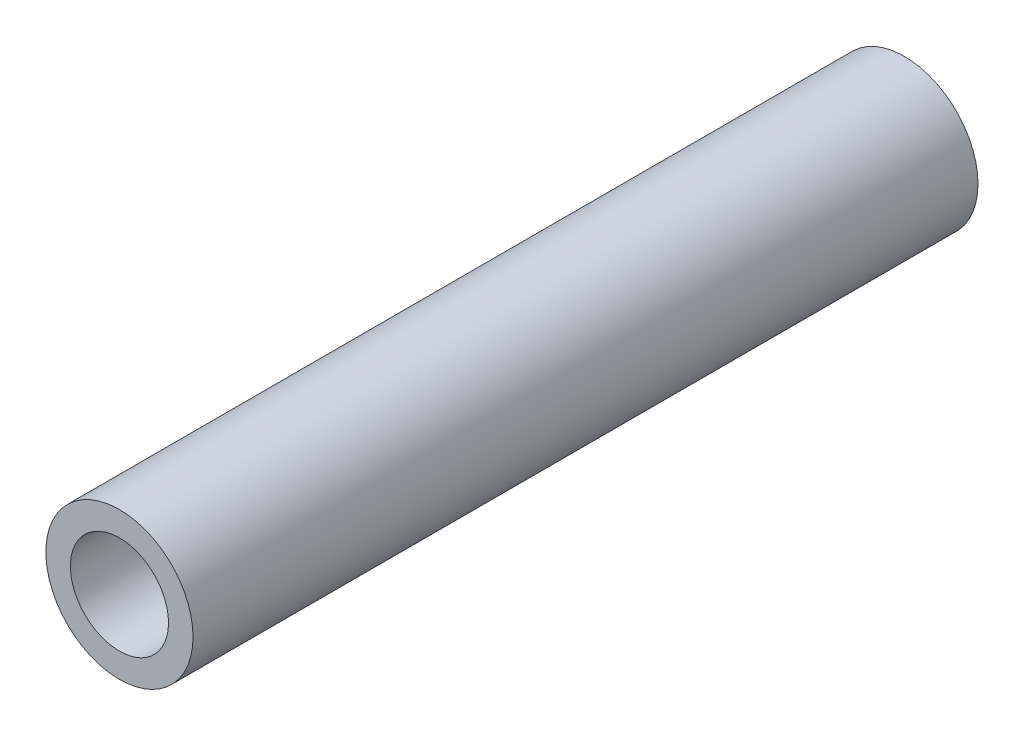
ISO-10303-21;
HEADER;
FILE_DESCRIPTION(('STEP AP214'),'2;1');
FILE_NAME('part.step','',(''),(''),'','','');
FILE_SCHEMA(('AUTOMOTIVE_DESIGN { 1 0 10303 214 1 1 1 1 }'));
ENDSEC;
DATA;
#1=APPLICATION_CONTEXT('core data for automotive mechanical design processes');
#2=APPLICATION_PROTOCOL_DEFINITION('international standard','automotive_design',2000,#1);
#3=PRODUCT_CONTEXT('',#1,'mechanical');
#4=PRODUCT('Part','Part','',(#3));
#5=PRODUCT_RELATED_PRODUCT_CATEGORY('part','',(#4));
#6=PRODUCT_DEFINITION_FORMATION('','',#4);
#7=PRODUCT_DEFINITION_CONTEXT('part definition',#1,'design');
#8=PRODUCT_DEFINITION('design','',#6,#7);
#9=PRODUCT_DEFINITION_SHAPE('','',#8);
#10=(LENGTH_UNIT() NAMED_UNIT(*) SI_UNIT(.MILLI.,.METRE.));
#11=(NAMED_UNIT(*) PLANE_ANGLE_UNIT() SI_UNIT($,.RADIAN.));
#12=(NAMED_UNIT(*) SI_UNIT($,.STERADIAN.) SOLID_ANGLE_UNIT());
#13=UNCERTAINTY_MEASURE_WITH_UNIT(LENGTH_MEASURE(1.E-05),#10,'distance_accuracy_value','');
#14=(GEOMETRIC_REPRESENTATION_CONTEXT(3) GLOBAL_UNCERTAINTY_ASSIGNED_CONTEXT((#13)) GLOBAL_UNIT_ASSIGNED_CONTEXT((#10,
#11,#12)) REPRESENTATION_CONTEXT('',''));
#15=CARTESIAN_POINT('',(0.,0.,0.));
#16=DIRECTION('',(0.,0.,1.));
#17=DIRECTION('',(1.,0.,0.));
#18=AXIS2_PLACEMENT_3D('',#15,#16,#17);
#19=CARTESIAN_POINT('',(0.,0.,32.));
#20=DIRECTION('',(0.,0.,1.));
#21=DIRECTION('',(1.,0.,0.));
#22=AXIS2_PLACEMENT_3D('',#19,#20,#21);
#23=PLANE('',#22);
#24=CARTESIAN_POINT('',(0.,0.,32.));
#25=DIRECTION('',(0.,0.,1.));
#26=DIRECTION('',(1.,0.,0.));
#27=AXIS2_PLACEMENT_3D('',#24,#25,#26);
#28=CIRCLE('',#27,3.);
#29=CARTESIAN_POINT('',(3.,0.,32.));
#30=VERTEX_POINT('',#29);
#31=EDGE_CURVE('E10',#30,#30,#28,.T.);
#32=ORIENTED_EDGE('',*,*,#31,.T.);
#33=EDGE_LOOP('',(#32));
#34=FACE_BOUND('',#33,.T.);
#35=CARTESIAN_POINT('',(0.,0.,32.));
#36=DIRECTION('',(0.,0.,1.));
#37=DIRECTION('',(1.,0.,0.));
#38=AXIS2_PLACEMENT_3D('',#35,#36,#37);
#39=CIRCLE('',#38,2.);
#40=CARTESIAN_POINT('',(2.,0.,32.));
#41=VERTEX_POINT('',#40);
#42=EDGE_CURVE('E54',#41,#41,#39,.T.);
#43=ORIENTED_EDGE('',*,*,#42,.F.);
#44=EDGE_LOOP('',(#43));
#45=FACE_BOUND('',#44,.T.);
#46=ADVANCED_FACE('F41',(#34,#45),#23,.T.);
#47=CARTESIAN_POINT('',(0.,0.,0.));
#48=DIRECTION('',(0.,0.,1.));
#49=DIRECTION('',(1.,0.,0.));
#50=AXIS2_PLACEMENT_3D('',#47,#48,#49);
#51=PLANE('',#50);
#52=CARTESIAN_POINT('',(0.,0.,0.));
#53=DIRECTION('',(0.,0.,1.));
#54=DIRECTION('',(1.,0.,0.));
#55=AXIS2_PLACEMENT_3D('',#52,#53,#54);
#56=CIRCLE('',#55,3.);
#57=CARTESIAN_POINT('',(3.,0.,0.));
#58=VERTEX_POINT('',#57);
#59=EDGE_CURVE('E45',#58,#58,#56,.T.);
#60=ORIENTED_EDGE('',*,*,#59,.F.);
#61=EDGE_LOOP('',(#60));
#62=FACE_BOUND('',#61,.T.);
#63=CARTESIAN_POINT('',(0.,0.,0.));
#64=DIRECTION('',(0.,0.,1.));
#65=DIRECTION('',(1.,0.,0.));
#66=AXIS2_PLACEMENT_3D('',#63,#64,#65);
#67=CIRCLE('',#66,2.);
#68=CARTESIAN_POINT('',(2.,0.,0.));
#69=VERTEX_POINT('',#68);
#70=EDGE_CURVE('E56',#69,#69,#67,.T.);
#71=ORIENTED_EDGE('',*,*,#70,.T.);
#72=EDGE_LOOP('',(#71));
#73=FACE_BOUND('',#72,.T.);
#74=ADVANCED_FACE('F68',(#62,#73),#51,.F.);
#75=CARTESIAN_POINT('',(0.,0.,32.));
#76=DIRECTION('',(0.,0.,-1.));
#77=DIRECTION('',(-1.,0.,0.));
#78=AXIS2_PLACEMENT_3D('',#75,#76,#77);
#79=CYLINDRICAL_SURFACE('',#78,3.);
#80=ORIENTED_EDGE('',*,*,#31,.F.);
#81=EDGE_LOOP('',(#80));
#82=FACE_BOUND('',#81,.T.);
#83=ORIENTED_EDGE('',*,*,#59,.T.);
#84=EDGE_LOOP('',(#83));
#85=FACE_BOUND('',#84,.T.);
#86=ADVANCED_FACE('F43',(#82,#85),#79,.T.);
#87=CARTESIAN_POINT('',(0.,0.,32.));
#88=DIRECTION('',(0.,0.,-1.));
#89=DIRECTION('',(-1.,0.,0.));
#90=AXIS2_PLACEMENT_3D('',#87,#88,#89);
#91=CYLINDRICAL_SURFACE('',#90,2.);
#92=ORIENTED_EDGE('',*,*,#42,.T.);
#93=EDGE_LOOP('',(#92));
#94=FACE_BOUND('',#93,.T.);
#95=ORIENTED_EDGE('',*,*,#70,.F.);
#96=EDGE_LOOP('',(#95));
#97=FACE_BOUND('',#96,.T.);
#98=ADVANCED_FACE('F64',(#94,#97),#91,.F.);
#99=CLOSED_SHELL('',(#46,#74,#86,#98));
#100=MANIFOLD_SOLID_BREP('B2',#99);
#101=ADVANCED_BREP_SHAPE_REPRESENTATION('',(#18,#100),#14);
#102=SHAPE_DEFINITION_REPRESENTATION(#9,#101);
ENDSEC;
END-ISO-10303-21;
